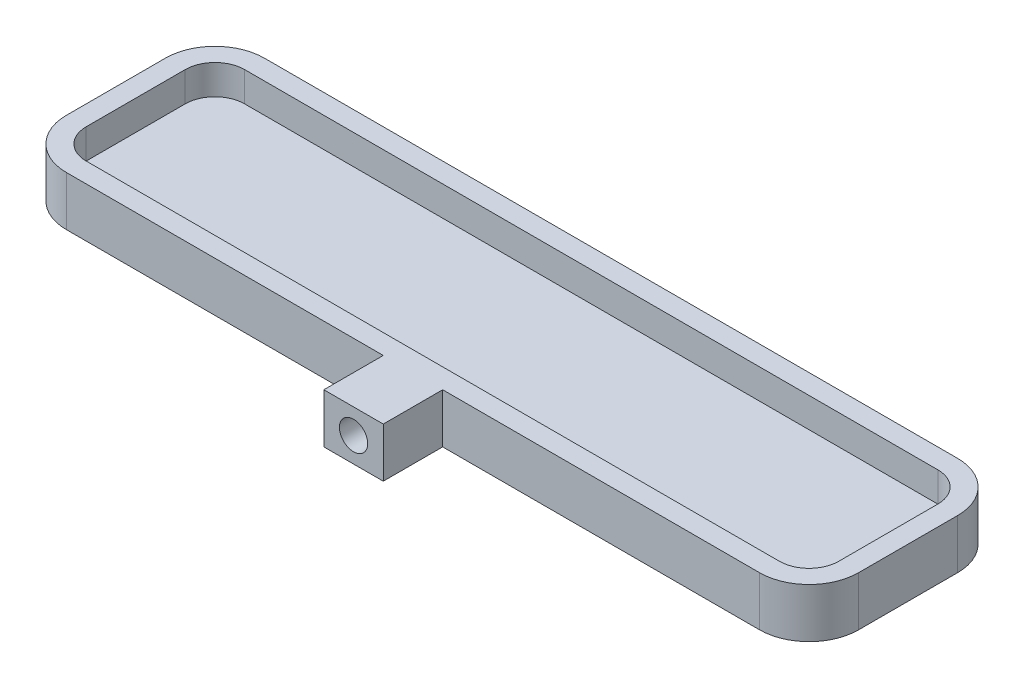
ISO-10303-21;
HEADER;
FILE_DESCRIPTION(('STEP AP214'),'2;1');
FILE_NAME('part.step','',(''),(''),'','','');
FILE_SCHEMA(('AUTOMOTIVE_DESIGN { 1 0 10303 214 1 1 1 1 }'));
ENDSEC;
DATA;
#1=APPLICATION_CONTEXT('core data for automotive mechanical design processes');
#2=APPLICATION_PROTOCOL_DEFINITION('international standard','automotive_design',2000,#1);
#3=PRODUCT_CONTEXT('',#1,'mechanical');
#4=PRODUCT('Part','Part','',(#3));
#5=PRODUCT_RELATED_PRODUCT_CATEGORY('part','',(#4));
#6=PRODUCT_DEFINITION_FORMATION('','',#4);
#7=PRODUCT_DEFINITION_CONTEXT('part definition',#1,'design');
#8=PRODUCT_DEFINITION('design','',#6,#7);
#9=PRODUCT_DEFINITION_SHAPE('','',#8);
#10=(LENGTH_UNIT() NAMED_UNIT(*) SI_UNIT(.MILLI.,.METRE.));
#11=(NAMED_UNIT(*) PLANE_ANGLE_UNIT() SI_UNIT($,.RADIAN.));
#12=(NAMED_UNIT(*) SI_UNIT($,.STERADIAN.) SOLID_ANGLE_UNIT());
#13=UNCERTAINTY_MEASURE_WITH_UNIT(LENGTH_MEASURE(1.E-05),#10,'distance_accuracy_value','');
#14=(GEOMETRIC_REPRESENTATION_CONTEXT(3) GLOBAL_UNCERTAINTY_ASSIGNED_CONTEXT((#13)) GLOBAL_UNIT_ASSIGNED_CONTEXT((#10,
#11,#12)) REPRESENTATION_CONTEXT('',''));
#15=CARTESIAN_POINT('',(0.,0.,0.));
#16=DIRECTION('',(0.,0.,1.));
#17=DIRECTION('',(1.,0.,0.));
#18=AXIS2_PLACEMENT_3D('',#15,#16,#17);
#19=CARTESIAN_POINT('',(-40.,5.,10.));
#20=DIRECTION('',(0.,0.,-1.));
#21=DIRECTION('',(-1.,0.,0.));
#22=AXIS2_PLACEMENT_3D('',#19,#20,#21);
#23=PLANE('',#22);
#24=DIRECTION('',(0.,-1.,0.));
#25=VECTOR('',#24,1.);
#26=CARTESIAN_POINT('',(-3.,0.,10.));
#27=LINE('',#26,#25);
#28=CARTESIAN_POINT('',(-3.,5.,10.));
#29=VERTEX_POINT('',#28);
#30=CARTESIAN_POINT('',(-3.,0.,10.));
#31=VERTEX_POINT('',#30);
#32=EDGE_CURVE('E63',#29,#31,#27,.T.);
#33=ORIENTED_EDGE('',*,*,#32,.F.);
#34=DIRECTION('',(1.,0.,0.));
#35=VECTOR('',#34,1.);
#36=CARTESIAN_POINT('',(-40.,5.,10.));
#37=LINE('',#36,#35);
#38=CARTESIAN_POINT('',(-35.,5.,10.));
#39=VERTEX_POINT('',#38);
#40=EDGE_CURVE('E310',#39,#29,#37,.T.);
#41=ORIENTED_EDGE('',*,*,#40,.F.);
#42=DIRECTION('',(0.,-1.,0.));
#43=VECTOR('',#42,1.);
#44=CARTESIAN_POINT('',(-35.,5.,10.));
#45=LINE('',#44,#43);
#46=CARTESIAN_POINT('',(-35.,0.,10.));
#47=VERTEX_POINT('',#46);
#48=EDGE_CURVE('E366',#39,#47,#45,.T.);
#49=ORIENTED_EDGE('',*,*,#48,.T.);
#50=DIRECTION('',(1.,0.,0.));
#51=VECTOR('',#50,1.);
#52=CARTESIAN_POINT('',(-40.,0.,10.));
#53=LINE('',#52,#51);
#54=EDGE_CURVE('E302',#47,#31,#53,.T.);
#55=ORIENTED_EDGE('',*,*,#54,.T.);
#56=EDGE_LOOP('',(#33,#41,#49,#55));
#57=FACE_BOUND('',#56,.T.);
#58=ADVANCED_FACE('F39',(#57),#23,.F.);
#59=DIRECTION('',(0.,1.,0.));
#60=VECTOR('',#59,1.);
#61=CARTESIAN_POINT('',(3.,0.,10.));
#62=LINE('',#61,#60);
#63=CARTESIAN_POINT('',(3.,0.,10.));
#64=VERTEX_POINT('',#63);
#65=CARTESIAN_POINT('',(3.,5.,10.));
#66=VERTEX_POINT('',#65);
#67=EDGE_CURVE('E202',#64,#66,#62,.T.);
#68=ORIENTED_EDGE('',*,*,#67,.F.);
#69=CARTESIAN_POINT('',(35.,0.,10.));
#70=VERTEX_POINT('',#69);
#71=EDGE_CURVE('E325',#64,#70,#53,.T.);
#72=ORIENTED_EDGE('',*,*,#71,.T.);
#73=DIRECTION('',(0.,-1.,0.));
#74=VECTOR('',#73,1.);
#75=CARTESIAN_POINT('',(35.,5.,10.));
#76=LINE('',#75,#74);
#77=CARTESIAN_POINT('',(35.,5.,10.));
#78=VERTEX_POINT('',#77);
#79=EDGE_CURVE('E370',#70,#78,#76,.F.);
#80=ORIENTED_EDGE('',*,*,#79,.T.);
#81=EDGE_CURVE('E55',#66,#78,#37,.T.);
#82=ORIENTED_EDGE('',*,*,#81,.F.);
#83=EDGE_LOOP('',(#68,#72,#80,#82));
#84=FACE_BOUND('',#83,.T.);
#85=ADVANCED_FACE('F403',(#84),#23,.F.);
#86=CARTESIAN_POINT('',(40.,5.,10.));
#87=DIRECTION('',(-1.,0.,0.));
#88=DIRECTION('',(0.,0.,1.));
#89=AXIS2_PLACEMENT_3D('',#86,#87,#88);
#90=PLANE('',#89);
#91=DIRECTION('',(0.,0.,-1.));
#92=VECTOR('',#91,1.);
#93=CARTESIAN_POINT('',(40.,0.,10.));
#94=LINE('',#93,#92);
#95=CARTESIAN_POINT('',(40.,0.,5.));
#96=VERTEX_POINT('',#95);
#97=CARTESIAN_POINT('',(40.,0.,-5.));
#98=VERTEX_POINT('',#97);
#99=EDGE_CURVE('E261',#96,#98,#94,.T.);
#100=ORIENTED_EDGE('',*,*,#99,.T.);
#101=DIRECTION('',(0.,-1.,0.));
#102=VECTOR('',#101,1.);
#103=CARTESIAN_POINT('',(40.,5.,-5.));
#104=LINE('',#103,#102);
#105=CARTESIAN_POINT('',(40.,5.,-5.));
#106=VERTEX_POINT('',#105);
#107=EDGE_CURVE('E351',#98,#106,#104,.F.);
#108=ORIENTED_EDGE('',*,*,#107,.T.);
#109=DIRECTION('',(0.,0.,-1.));
#110=VECTOR('',#109,1.);
#111=CARTESIAN_POINT('',(40.,5.,10.));
#112=LINE('',#111,#110);
#113=CARTESIAN_POINT('',(40.,5.,5.));
#114=VERTEX_POINT('',#113);
#115=EDGE_CURVE('E297',#114,#106,#112,.T.);
#116=ORIENTED_EDGE('',*,*,#115,.F.);
#117=DIRECTION('',(0.,-1.,0.));
#118=VECTOR('',#117,1.);
#119=CARTESIAN_POINT('',(40.,5.,5.));
#120=LINE('',#119,#118);
#121=EDGE_CURVE('E347',#114,#96,#120,.T.);
#122=ORIENTED_EDGE('',*,*,#121,.T.);
#123=EDGE_LOOP('',(#100,#108,#116,#122));
#124=FACE_BOUND('',#123,.T.);
#125=ADVANCED_FACE('F409',(#124),#90,.F.);
#126=CARTESIAN_POINT('',(-40.,5.,-10.));
#127=DIRECTION('',(0.,0.,1.));
#128=DIRECTION('',(1.,0.,0.));
#129=AXIS2_PLACEMENT_3D('',#126,#127,#128);
#130=PLANE('',#129);
#131=DIRECTION('',(-1.,0.,0.));
#132=VECTOR('',#131,1.);
#133=CARTESIAN_POINT('',(-40.,5.,-10.));
#134=LINE('',#133,#132);
#135=CARTESIAN_POINT('',(35.,5.,-10.));
#136=VERTEX_POINT('',#135);
#137=CARTESIAN_POINT('',(-35.,5.,-10.));
#138=VERTEX_POINT('',#137);
#139=EDGE_CURVE('E301',#136,#138,#134,.T.);
#140=ORIENTED_EDGE('',*,*,#139,.F.);
#141=DIRECTION('',(0.,-1.,0.));
#142=VECTOR('',#141,1.);
#143=CARTESIAN_POINT('',(35.,5.,-10.));
#144=LINE('',#143,#142);
#145=CARTESIAN_POINT('',(35.,0.,-10.));
#146=VERTEX_POINT('',#145);
#147=EDGE_CURVE('E330',#136,#146,#144,.T.);
#148=ORIENTED_EDGE('',*,*,#147,.T.);
#149=DIRECTION('',(-1.,0.,0.));
#150=VECTOR('',#149,1.);
#151=CARTESIAN_POINT('',(-40.,0.,-10.));
#152=LINE('',#151,#150);
#153=CARTESIAN_POINT('',(-35.,0.,-10.));
#154=VERTEX_POINT('',#153);
#155=EDGE_CURVE('E317',#146,#154,#152,.T.);
#156=ORIENTED_EDGE('',*,*,#155,.T.);
#157=DIRECTION('',(0.,-1.,0.));
#158=VECTOR('',#157,1.);
#159=CARTESIAN_POINT('',(-35.,5.,-10.));
#160=LINE('',#159,#158);
#161=EDGE_CURVE('E313',#154,#138,#160,.F.);
#162=ORIENTED_EDGE('',*,*,#161,.T.);
#163=EDGE_LOOP('',(#140,#148,#156,#162));
#164=FACE_BOUND('',#163,.T.);
#165=ADVANCED_FACE('F389',(#164),#130,.F.);
#166=CARTESIAN_POINT('',(-40.,5.,10.));
#167=DIRECTION('',(1.,0.,0.));
#168=DIRECTION('',(0.,0.,-1.));
#169=AXIS2_PLACEMENT_3D('',#166,#167,#168);
#170=PLANE('',#169);
#171=DIRECTION('',(0.,0.,1.));
#172=VECTOR('',#171,1.);
#173=CARTESIAN_POINT('',(-40.,5.,10.));
#174=LINE('',#173,#172);
#175=CARTESIAN_POINT('',(-40.,5.,-5.));
#176=VERTEX_POINT('',#175);
#177=CARTESIAN_POINT('',(-40.,5.,5.));
#178=VERTEX_POINT('',#177);
#179=EDGE_CURVE('E306',#176,#178,#174,.T.);
#180=ORIENTED_EDGE('',*,*,#179,.F.);
#181=DIRECTION('',(0.,-1.,0.));
#182=VECTOR('',#181,1.);
#183=CARTESIAN_POINT('',(-40.,5.,-5.));
#184=LINE('',#183,#182);
#185=CARTESIAN_POINT('',(-40.,0.,-5.));
#186=VERTEX_POINT('',#185);
#187=EDGE_CURVE('E11',#176,#186,#184,.T.);
#188=ORIENTED_EDGE('',*,*,#187,.T.);
#189=DIRECTION('',(0.,0.,1.));
#190=VECTOR('',#189,1.);
#191=CARTESIAN_POINT('',(-40.,0.,10.));
#192=LINE('',#191,#190);
#193=CARTESIAN_POINT('',(-40.,0.,5.));
#194=VERTEX_POINT('',#193);
#195=EDGE_CURVE('E321',#186,#194,#192,.T.);
#196=ORIENTED_EDGE('',*,*,#195,.T.);
#197=DIRECTION('',(0.,-1.,0.));
#198=VECTOR('',#197,1.);
#199=CARTESIAN_POINT('',(-40.,5.,5.));
#200=LINE('',#199,#198);
#201=EDGE_CURVE('E48',#194,#178,#200,.F.);
#202=ORIENTED_EDGE('',*,*,#201,.T.);
#203=EDGE_LOOP('',(#180,#188,#196,#202));
#204=FACE_BOUND('',#203,.T.);
#205=ADVANCED_FACE('F376',(#204),#170,.F.);
#206=CARTESIAN_POINT('',(0.,5.,0.));
#207=DIRECTION('',(0.,-1.,0.));
#208=DIRECTION('',(0.,0.,-1.));
#209=AXIS2_PLACEMENT_3D('',#206,#207,#208);
#210=PLANE('',#209);
#211=DIRECTION('',(0.,0.,-1.));
#212=VECTOR('',#211,1.);
#213=CARTESIAN_POINT('',(38.,5.,0.));
#214=LINE('',#213,#212);
#215=CARTESIAN_POINT('',(38.,5.,5.));
#216=VERTEX_POINT('',#215);
#217=CARTESIAN_POINT('',(38.,5.,-5.));
#218=VERTEX_POINT('',#217);
#219=EDGE_CURVE('E240',#216,#218,#214,.T.);
#220=ORIENTED_EDGE('',*,*,#219,.F.);
#221=CARTESIAN_POINT('',(35.,5.,5.));
#222=DIRECTION('',(0.,-1.,0.));
#223=DIRECTION('',(0.,0.,-1.));
#224=AXIS2_PLACEMENT_3D('',#221,#222,#223);
#225=CIRCLE('',#224,3.);
#226=CARTESIAN_POINT('',(35.,5.,8.));
#227=VERTEX_POINT('',#226);
#228=EDGE_CURVE('E280',#227,#216,#225,.F.);
#229=ORIENTED_EDGE('',*,*,#228,.F.);
#230=DIRECTION('',(1.,0.,0.));
#231=VECTOR('',#230,1.);
#232=CARTESIAN_POINT('',(0.,5.,8.));
#233=LINE('',#232,#231);
#234=CARTESIAN_POINT('',(-35.,5.,8.));
#235=VERTEX_POINT('',#234);
#236=EDGE_CURVE('E256',#235,#227,#233,.T.);
#237=ORIENTED_EDGE('',*,*,#236,.F.);
#238=CARTESIAN_POINT('',(-35.,5.,5.));
#239=DIRECTION('',(0.,-1.,0.));
#240=DIRECTION('',(0.,0.,-1.));
#241=AXIS2_PLACEMENT_3D('',#238,#239,#240);
#242=CIRCLE('',#241,3.);
#243=CARTESIAN_POINT('',(-38.,5.,5.));
#244=VERTEX_POINT('',#243);
#245=EDGE_CURVE('E220',#244,#235,#242,.F.);
#246=ORIENTED_EDGE('',*,*,#245,.F.);
#247=DIRECTION('',(0.,0.,1.));
#248=VECTOR('',#247,1.);
#249=CARTESIAN_POINT('',(-38.,5.,0.));
#250=LINE('',#249,#248);
#251=CARTESIAN_POINT('',(-38.,5.,-5.));
#252=VERTEX_POINT('',#251);
#253=EDGE_CURVE('E284',#252,#244,#250,.T.);
#254=ORIENTED_EDGE('',*,*,#253,.F.);
#255=CARTESIAN_POINT('',(-35.,5.,-5.));
#256=DIRECTION('',(0.,-1.,0.));
#257=DIRECTION('',(0.,0.,-1.));
#258=AXIS2_PLACEMENT_3D('',#255,#256,#257);
#259=CIRCLE('',#258,3.);
#260=CARTESIAN_POINT('',(-35.,5.,-8.));
#261=VERTEX_POINT('',#260);
#262=EDGE_CURVE('E285',#261,#252,#259,.F.);
#263=ORIENTED_EDGE('',*,*,#262,.F.);
#264=DIRECTION('',(-1.,0.,0.));
#265=VECTOR('',#264,1.);
#266=CARTESIAN_POINT('',(0.,5.,-8.));
#267=LINE('',#266,#265);
#268=CARTESIAN_POINT('',(35.,5.,-8.));
#269=VERTEX_POINT('',#268);
#270=EDGE_CURVE('E277',#269,#261,#267,.T.);
#271=ORIENTED_EDGE('',*,*,#270,.F.);
#272=CARTESIAN_POINT('',(35.,5.,-5.));
#273=DIRECTION('',(0.,-1.,0.));
#274=DIRECTION('',(0.,0.,-1.));
#275=AXIS2_PLACEMENT_3D('',#272,#273,#274);
#276=CIRCLE('',#275,3.);
#277=EDGE_CURVE('E270',#218,#269,#276,.F.);
#278=ORIENTED_EDGE('',*,*,#277,.F.);
#279=EDGE_LOOP('',(#220,#229,#237,#246,#254,#263,#271,#278));
#280=FACE_BOUND('',#279,.T.);
#281=ORIENTED_EDGE('',*,*,#115,.T.);
#282=CARTESIAN_POINT('',(35.,5.,-5.));
#283=DIRECTION('',(0.,-1.,0.));
#284=DIRECTION('',(0.,0.,-1.));
#285=AXIS2_PLACEMENT_3D('',#282,#283,#284);
#286=CIRCLE('',#285,5.);
#287=EDGE_CURVE('E363',#106,#136,#286,.F.);
#288=ORIENTED_EDGE('',*,*,#287,.T.);
#289=ORIENTED_EDGE('',*,*,#139,.T.);
#290=CARTESIAN_POINT('',(-35.,5.,-5.));
#291=DIRECTION('',(0.,-1.,0.));
#292=DIRECTION('',(0.,0.,-1.));
#293=AXIS2_PLACEMENT_3D('',#290,#291,#292);
#294=CIRCLE('',#293,5.);
#295=EDGE_CURVE('E357',#138,#176,#294,.F.);
#296=ORIENTED_EDGE('',*,*,#295,.T.);
#297=ORIENTED_EDGE('',*,*,#179,.T.);
#298=CARTESIAN_POINT('',(-35.,5.,5.));
#299=DIRECTION('',(0.,-1.,0.));
#300=DIRECTION('',(0.,0.,-1.));
#301=AXIS2_PLACEMENT_3D('',#298,#299,#300);
#302=CIRCLE('',#301,5.);
#303=EDGE_CURVE('E354',#178,#39,#302,.F.);
#304=ORIENTED_EDGE('',*,*,#303,.T.);
#305=ORIENTED_EDGE('',*,*,#40,.T.);
#306=DIRECTION('',(0.,0.,-1.));
#307=VECTOR('',#306,1.);
#308=CARTESIAN_POINT('',(-3.,5.,16.));
#309=LINE('',#308,#307);
#310=CARTESIAN_POINT('',(-3.,5.,16.));
#311=VERTEX_POINT('',#310);
#312=EDGE_CURVE('E442',#311,#29,#309,.T.);
#313=ORIENTED_EDGE('',*,*,#312,.F.);
#314=DIRECTION('',(-1.,0.,0.));
#315=VECTOR('',#314,1.);
#316=CARTESIAN_POINT('',(-3.,5.,16.));
#317=LINE('',#316,#315);
#318=CARTESIAN_POINT('',(3.,5.,16.));
#319=VERTEX_POINT('',#318);
#320=EDGE_CURVE('E197',#319,#311,#317,.T.);
#321=ORIENTED_EDGE('',*,*,#320,.F.);
#322=DIRECTION('',(0.,0.,-1.));
#323=VECTOR('',#322,1.);
#324=CARTESIAN_POINT('',(3.,5.,16.));
#325=LINE('',#324,#323);
#326=EDGE_CURVE('E213',#319,#66,#325,.T.);
#327=ORIENTED_EDGE('',*,*,#326,.T.);
#328=ORIENTED_EDGE('',*,*,#81,.T.);
#329=CARTESIAN_POINT('',(35.,5.,5.));
#330=DIRECTION('',(0.,-1.,0.));
#331=DIRECTION('',(0.,0.,-1.));
#332=AXIS2_PLACEMENT_3D('',#329,#330,#331);
#333=CIRCLE('',#332,5.);
#334=EDGE_CURVE('E360',#78,#114,#333,.F.);
#335=ORIENTED_EDGE('',*,*,#334,.T.);
#336=EDGE_LOOP('',(#281,#288,#289,#296,#297,#304,#305,#313,#321,#327,#328,#335));
#337=FACE_BOUND('',#336,.T.);
#338=ADVANCED_FACE('F382',(#280,#337),#210,.F.);
#339=CARTESIAN_POINT('',(0.,0.,0.));
#340=DIRECTION('',(0.,-1.,0.));
#341=DIRECTION('',(0.,0.,-1.));
#342=AXIS2_PLACEMENT_3D('',#339,#340,#341);
#343=PLANE('',#342);
#344=ORIENTED_EDGE('',*,*,#155,.F.);
#345=CARTESIAN_POINT('',(35.,0.,-5.));
#346=DIRECTION('',(0.,-1.,0.));
#347=DIRECTION('',(0.,0.,-1.));
#348=AXIS2_PLACEMENT_3D('',#345,#346,#347);
#349=CIRCLE('',#348,5.);
#350=EDGE_CURVE('E344',#146,#98,#349,.T.);
#351=ORIENTED_EDGE('',*,*,#350,.T.);
#352=ORIENTED_EDGE('',*,*,#99,.F.);
#353=CARTESIAN_POINT('',(35.,0.,5.));
#354=DIRECTION('',(0.,-1.,0.));
#355=DIRECTION('',(0.,0.,-1.));
#356=AXIS2_PLACEMENT_3D('',#353,#354,#355);
#357=CIRCLE('',#356,5.);
#358=EDGE_CURVE('E340',#96,#70,#357,.T.);
#359=ORIENTED_EDGE('',*,*,#358,.T.);
#360=ORIENTED_EDGE('',*,*,#71,.F.);
#361=DIRECTION('',(0.,0.,-1.));
#362=VECTOR('',#361,1.);
#363=CARTESIAN_POINT('',(3.,0.,16.));
#364=LINE('',#363,#362);
#365=CARTESIAN_POINT('',(3.,0.,16.));
#366=VERTEX_POINT('',#365);
#367=EDGE_CURVE('E187',#366,#64,#364,.T.);
#368=ORIENTED_EDGE('',*,*,#367,.F.);
#369=DIRECTION('',(1.,0.,0.));
#370=VECTOR('',#369,1.);
#371=CARTESIAN_POINT('',(-3.,0.,16.));
#372=LINE('',#371,#370);
#373=CARTESIAN_POINT('',(-3.,0.,16.));
#374=VERTEX_POINT('',#373);
#375=EDGE_CURVE('E179',#374,#366,#372,.T.);
#376=ORIENTED_EDGE('',*,*,#375,.F.);
#377=DIRECTION('',(0.,0.,-1.));
#378=VECTOR('',#377,1.);
#379=CARTESIAN_POINT('',(-3.,0.,16.));
#380=LINE('',#379,#378);
#381=EDGE_CURVE('E185',#374,#31,#380,.T.);
#382=ORIENTED_EDGE('',*,*,#381,.T.);
#383=ORIENTED_EDGE('',*,*,#54,.F.);
#384=CARTESIAN_POINT('',(-35.,0.,5.));
#385=DIRECTION('',(0.,-1.,0.));
#386=DIRECTION('',(0.,0.,-1.));
#387=AXIS2_PLACEMENT_3D('',#384,#385,#386);
#388=CIRCLE('',#387,5.);
#389=EDGE_CURVE('E334',#47,#194,#388,.T.);
#390=ORIENTED_EDGE('',*,*,#389,.T.);
#391=ORIENTED_EDGE('',*,*,#195,.F.);
#392=CARTESIAN_POINT('',(-35.,0.,-5.));
#393=DIRECTION('',(0.,-1.,0.));
#394=DIRECTION('',(0.,0.,-1.));
#395=AXIS2_PLACEMENT_3D('',#392,#393,#394);
#396=CIRCLE('',#395,5.);
#397=EDGE_CURVE('E337',#186,#154,#396,.T.);
#398=ORIENTED_EDGE('',*,*,#397,.T.);
#399=EDGE_LOOP('',(#344,#351,#352,#359,#360,#368,#376,#382,#383,#390,#391,#398));
#400=FACE_BOUND('',#399,.T.);
#401=ADVANCED_FACE('F182',(#400),#343,.T.);
#402=CARTESIAN_POINT('',(35.,5.,-5.));
#403=DIRECTION('',(0.,-1.,0.));
#404=DIRECTION('',(0.,0.,-1.));
#405=AXIS2_PLACEMENT_3D('',#402,#403,#404);
#406=CYLINDRICAL_SURFACE('',#405,5.);
#407=ORIENTED_EDGE('',*,*,#287,.F.);
#408=ORIENTED_EDGE('',*,*,#107,.F.);
#409=ORIENTED_EDGE('',*,*,#350,.F.);
#410=ORIENTED_EDGE('',*,*,#147,.F.);
#411=EDGE_LOOP('',(#407,#408,#409,#410));
#412=FACE_BOUND('',#411,.T.);
#413=ADVANCED_FACE('F399',(#412),#406,.T.);
#414=CARTESIAN_POINT('',(35.,5.,5.));
#415=DIRECTION('',(0.,-1.,0.));
#416=DIRECTION('',(0.,0.,-1.));
#417=AXIS2_PLACEMENT_3D('',#414,#415,#416);
#418=CYLINDRICAL_SURFACE('',#417,5.);
#419=ORIENTED_EDGE('',*,*,#334,.F.);
#420=ORIENTED_EDGE('',*,*,#79,.F.);
#421=ORIENTED_EDGE('',*,*,#358,.F.);
#422=ORIENTED_EDGE('',*,*,#121,.F.);
#423=EDGE_LOOP('',(#419,#420,#421,#422));
#424=FACE_BOUND('',#423,.T.);
#425=ADVANCED_FACE('F393',(#424),#418,.T.);
#426=CARTESIAN_POINT('',(-35.,5.,-5.));
#427=DIRECTION('',(0.,-1.,0.));
#428=DIRECTION('',(0.,0.,-1.));
#429=AXIS2_PLACEMENT_3D('',#426,#427,#428);
#430=CYLINDRICAL_SURFACE('',#429,5.);
#431=ORIENTED_EDGE('',*,*,#295,.F.);
#432=ORIENTED_EDGE('',*,*,#161,.F.);
#433=ORIENTED_EDGE('',*,*,#397,.F.);
#434=ORIENTED_EDGE('',*,*,#187,.F.);
#435=EDGE_LOOP('',(#431,#432,#433,#434));
#436=FACE_BOUND('',#435,.T.);
#437=ADVANCED_FACE('F391',(#436),#430,.T.);
#438=CARTESIAN_POINT('',(-35.,5.,5.));
#439=DIRECTION('',(0.,-1.,0.));
#440=DIRECTION('',(0.,0.,-1.));
#441=AXIS2_PLACEMENT_3D('',#438,#439,#440);
#442=CYLINDRICAL_SURFACE('',#441,5.);
#443=ORIENTED_EDGE('',*,*,#303,.F.);
#444=ORIENTED_EDGE('',*,*,#201,.F.);
#445=ORIENTED_EDGE('',*,*,#389,.F.);
#446=ORIENTED_EDGE('',*,*,#48,.F.);
#447=EDGE_LOOP('',(#443,#444,#445,#446));
#448=FACE_BOUND('',#447,.T.);
#449=ADVANCED_FACE('F41',(#448),#442,.T.);
#450=CARTESIAN_POINT('',(38.,5.,10.));
#451=DIRECTION('',(-1.,0.,0.));
#452=DIRECTION('',(0.,0.,1.));
#453=AXIS2_PLACEMENT_3D('',#450,#451,#452);
#454=PLANE('',#453);
#455=DIRECTION('',(0.,0.,-1.));
#456=VECTOR('',#455,1.);
#457=CARTESIAN_POINT('',(38.,2.,0.));
#458=LINE('',#457,#456);
#459=CARTESIAN_POINT('',(38.,2.,5.));
#460=VERTEX_POINT('',#459);
#461=CARTESIAN_POINT('',(38.,2.,-5.));
#462=VERTEX_POINT('',#461);
#463=EDGE_CURVE('E206',#460,#462,#458,.T.);
#464=ORIENTED_EDGE('',*,*,#463,.F.);
#465=DIRECTION('',(0.,1.,0.));
#466=VECTOR('',#465,1.);
#467=CARTESIAN_POINT('',(38.,5.,5.));
#468=LINE('',#467,#466);
#469=EDGE_CURVE('E221',#216,#460,#468,.F.);
#470=ORIENTED_EDGE('',*,*,#469,.F.);
#471=ORIENTED_EDGE('',*,*,#219,.T.);
#472=DIRECTION('',(0.,1.,0.));
#473=VECTOR('',#472,1.);
#474=CARTESIAN_POINT('',(38.,5.,-5.));
#475=LINE('',#474,#473);
#476=EDGE_CURVE('E217',#462,#218,#475,.T.);
#477=ORIENTED_EDGE('',*,*,#476,.F.);
#478=EDGE_LOOP('',(#464,#470,#471,#477));
#479=FACE_BOUND('',#478,.T.);
#480=ADVANCED_FACE('F398',(#479),#454,.T.);
#481=CARTESIAN_POINT('',(-40.,5.,-8.));
#482=DIRECTION('',(0.,0.,1.));
#483=DIRECTION('',(1.,0.,0.));
#484=AXIS2_PLACEMENT_3D('',#481,#482,#483);
#485=PLANE('',#484);
#486=ORIENTED_EDGE('',*,*,#270,.T.);
#487=DIRECTION('',(0.,1.,0.));
#488=VECTOR('',#487,1.);
#489=CARTESIAN_POINT('',(-35.,5.,-8.));
#490=LINE('',#489,#488);
#491=CARTESIAN_POINT('',(-35.,2.,-8.));
#492=VERTEX_POINT('',#491);
#493=EDGE_CURVE('E253',#492,#261,#490,.T.);
#494=ORIENTED_EDGE('',*,*,#493,.F.);
#495=DIRECTION('',(-1.,0.,0.));
#496=VECTOR('',#495,1.);
#497=CARTESIAN_POINT('',(0.,2.,-8.));
#498=LINE('',#497,#496);
#499=CARTESIAN_POINT('',(35.,2.,-8.));
#500=VERTEX_POINT('',#499);
#501=EDGE_CURVE('E211',#500,#492,#498,.T.);
#502=ORIENTED_EDGE('',*,*,#501,.F.);
#503=DIRECTION('',(0.,1.,0.));
#504=VECTOR('',#503,1.);
#505=CARTESIAN_POINT('',(35.,5.,-8.));
#506=LINE('',#505,#504);
#507=EDGE_CURVE('E244',#269,#500,#506,.F.);
#508=ORIENTED_EDGE('',*,*,#507,.F.);
#509=EDGE_LOOP('',(#486,#494,#502,#508));
#510=FACE_BOUND('',#509,.T.);
#511=ADVANCED_FACE('F481',(#510),#485,.T.);
#512=CARTESIAN_POINT('',(-38.,5.,10.));
#513=DIRECTION('',(1.,0.,0.));
#514=DIRECTION('',(0.,0.,-1.));
#515=AXIS2_PLACEMENT_3D('',#512,#513,#514);
#516=PLANE('',#515);
#517=ORIENTED_EDGE('',*,*,#253,.T.);
#518=DIRECTION('',(0.,1.,0.));
#519=VECTOR('',#518,1.);
#520=CARTESIAN_POINT('',(-38.,5.,5.));
#521=LINE('',#520,#519);
#522=CARTESIAN_POINT('',(-38.,2.,5.));
#523=VERTEX_POINT('',#522);
#524=EDGE_CURVE('E262',#523,#244,#521,.T.);
#525=ORIENTED_EDGE('',*,*,#524,.F.);
#526=DIRECTION('',(0.,0.,1.));
#527=VECTOR('',#526,1.);
#528=CARTESIAN_POINT('',(-38.,2.,0.));
#529=LINE('',#528,#527);
#530=CARTESIAN_POINT('',(-38.,2.,-5.));
#531=VERTEX_POINT('',#530);
#532=EDGE_CURVE('E229',#531,#523,#529,.T.);
#533=ORIENTED_EDGE('',*,*,#532,.F.);
#534=DIRECTION('',(0.,1.,0.));
#535=VECTOR('',#534,1.);
#536=CARTESIAN_POINT('',(-38.,5.,-5.));
#537=LINE('',#536,#535);
#538=EDGE_CURVE('E257',#252,#531,#537,.F.);
#539=ORIENTED_EDGE('',*,*,#538,.F.);
#540=EDGE_LOOP('',(#517,#525,#533,#539));
#541=FACE_BOUND('',#540,.T.);
#542=ADVANCED_FACE('F485',(#541),#516,.T.);
#543=CARTESIAN_POINT('',(-40.,5.,8.));
#544=DIRECTION('',(0.,0.,-1.));
#545=DIRECTION('',(-1.,0.,0.));
#546=AXIS2_PLACEMENT_3D('',#543,#544,#545);
#547=PLANE('',#546);
#548=DIRECTION('',(1.,0.,0.));
#549=VECTOR('',#548,1.);
#550=CARTESIAN_POINT('',(0.,2.,8.));
#551=LINE('',#550,#549);
#552=CARTESIAN_POINT('',(-35.,2.,8.));
#553=VERTEX_POINT('',#552);
#554=CARTESIAN_POINT('',(35.,2.,8.));
#555=VERTEX_POINT('',#554);
#556=EDGE_CURVE('E236',#553,#555,#551,.T.);
#557=ORIENTED_EDGE('',*,*,#556,.F.);
#558=DIRECTION('',(0.,1.,0.));
#559=VECTOR('',#558,1.);
#560=CARTESIAN_POINT('',(-35.,5.,8.));
#561=LINE('',#560,#559);
#562=EDGE_CURVE('E266',#235,#553,#561,.F.);
#563=ORIENTED_EDGE('',*,*,#562,.F.);
#564=ORIENTED_EDGE('',*,*,#236,.T.);
#565=DIRECTION('',(0.,1.,0.));
#566=VECTOR('',#565,1.);
#567=CARTESIAN_POINT('',(35.,5.,8.));
#568=LINE('',#567,#566);
#569=EDGE_CURVE('E265',#555,#227,#568,.T.);
#570=ORIENTED_EDGE('',*,*,#569,.F.);
#571=EDGE_LOOP('',(#557,#563,#564,#570));
#572=FACE_BOUND('',#571,.T.);
#573=ADVANCED_FACE('F489',(#572),#547,.T.);
#574=CARTESIAN_POINT('',(0.,2.,0.));
#575=DIRECTION('',(0.,-1.,0.));
#576=DIRECTION('',(0.,0.,-1.));
#577=AXIS2_PLACEMENT_3D('',#574,#575,#576);
#578=PLANE('',#577);
#579=ORIENTED_EDGE('',*,*,#501,.T.);
#580=CARTESIAN_POINT('',(-35.,2.,-5.));
#581=DIRECTION('',(0.,-1.,0.));
#582=DIRECTION('',(0.,0.,-1.));
#583=AXIS2_PLACEMENT_3D('',#580,#581,#582);
#584=CIRCLE('',#583,3.);
#585=EDGE_CURVE('E235',#531,#492,#584,.T.);
#586=ORIENTED_EDGE('',*,*,#585,.F.);
#587=ORIENTED_EDGE('',*,*,#532,.T.);
#588=CARTESIAN_POINT('',(-35.,2.,5.));
#589=DIRECTION('',(0.,-1.,0.));
#590=DIRECTION('',(0.,0.,-1.));
#591=AXIS2_PLACEMENT_3D('',#588,#589,#590);
#592=CIRCLE('',#591,3.);
#593=EDGE_CURVE('E241',#553,#523,#592,.T.);
#594=ORIENTED_EDGE('',*,*,#593,.F.);
#595=ORIENTED_EDGE('',*,*,#556,.T.);
#596=CARTESIAN_POINT('',(35.,2.,5.));
#597=DIRECTION('',(0.,-1.,0.));
#598=DIRECTION('',(0.,0.,-1.));
#599=AXIS2_PLACEMENT_3D('',#596,#597,#598);
#600=CIRCLE('',#599,3.);
#601=EDGE_CURVE('E232',#460,#555,#600,.T.);
#602=ORIENTED_EDGE('',*,*,#601,.F.);
#603=ORIENTED_EDGE('',*,*,#463,.T.);
#604=CARTESIAN_POINT('',(35.,2.,-5.));
#605=DIRECTION('',(0.,-1.,0.));
#606=DIRECTION('',(0.,0.,-1.));
#607=AXIS2_PLACEMENT_3D('',#604,#605,#606);
#608=CIRCLE('',#607,3.);
#609=EDGE_CURVE('E225',#500,#462,#608,.T.);
#610=ORIENTED_EDGE('',*,*,#609,.F.);
#611=EDGE_LOOP('',(#579,#586,#587,#594,#595,#602,#603,#610));
#612=FACE_BOUND('',#611,.T.);
#613=ADVANCED_FACE('F493',(#612),#578,.F.);
#614=CARTESIAN_POINT('',(35.,5.,-5.));
#615=DIRECTION('',(0.,-1.,0.));
#616=DIRECTION('',(0.,0.,-1.));
#617=AXIS2_PLACEMENT_3D('',#614,#615,#616);
#618=CYLINDRICAL_SURFACE('',#617,3.);
#619=ORIENTED_EDGE('',*,*,#277,.T.);
#620=ORIENTED_EDGE('',*,*,#507,.T.);
#621=ORIENTED_EDGE('',*,*,#609,.T.);
#622=ORIENTED_EDGE('',*,*,#476,.T.);
#623=EDGE_LOOP('',(#619,#620,#621,#622));
#624=FACE_BOUND('',#623,.T.);
#625=ADVANCED_FACE('F497',(#624),#618,.F.);
#626=CARTESIAN_POINT('',(35.,5.,5.));
#627=DIRECTION('',(0.,-1.,0.));
#628=DIRECTION('',(0.,0.,-1.));
#629=AXIS2_PLACEMENT_3D('',#626,#627,#628);
#630=CYLINDRICAL_SURFACE('',#629,3.);
#631=ORIENTED_EDGE('',*,*,#228,.T.);
#632=ORIENTED_EDGE('',*,*,#469,.T.);
#633=ORIENTED_EDGE('',*,*,#601,.T.);
#634=ORIENTED_EDGE('',*,*,#569,.T.);
#635=EDGE_LOOP('',(#631,#632,#633,#634));
#636=FACE_BOUND('',#635,.T.);
#637=ADVANCED_FACE('F501',(#636),#630,.F.);
#638=CARTESIAN_POINT('',(-35.,5.,-5.));
#639=DIRECTION('',(0.,-1.,0.));
#640=DIRECTION('',(0.,0.,-1.));
#641=AXIS2_PLACEMENT_3D('',#638,#639,#640);
#642=CYLINDRICAL_SURFACE('',#641,3.);
#643=ORIENTED_EDGE('',*,*,#262,.T.);
#644=ORIENTED_EDGE('',*,*,#538,.T.);
#645=ORIENTED_EDGE('',*,*,#585,.T.);
#646=ORIENTED_EDGE('',*,*,#493,.T.);
#647=EDGE_LOOP('',(#643,#644,#645,#646));
#648=FACE_BOUND('',#647,.T.);
#649=ADVANCED_FACE('F505',(#648),#642,.F.);
#650=CARTESIAN_POINT('',(-35.,5.,5.));
#651=DIRECTION('',(0.,-1.,0.));
#652=DIRECTION('',(0.,0.,-1.));
#653=AXIS2_PLACEMENT_3D('',#650,#651,#652);
#654=CYLINDRICAL_SURFACE('',#653,3.);
#655=ORIENTED_EDGE('',*,*,#245,.T.);
#656=ORIENTED_EDGE('',*,*,#562,.T.);
#657=ORIENTED_EDGE('',*,*,#593,.T.);
#658=ORIENTED_EDGE('',*,*,#524,.T.);
#659=EDGE_LOOP('',(#655,#656,#657,#658));
#660=FACE_BOUND('',#659,.T.);
#661=ADVANCED_FACE('F478',(#660),#654,.F.);
#662=CARTESIAN_POINT('',(-3.,0.,16.));
#663=DIRECTION('',(1.,0.,0.));
#664=DIRECTION('',(0.,1.,0.));
#665=AXIS2_PLACEMENT_3D('',#662,#663,#664);
#666=PLANE('',#665);
#667=ORIENTED_EDGE('',*,*,#32,.T.);
#668=ORIENTED_EDGE('',*,*,#381,.F.);
#669=DIRECTION('',(0.,-1.,0.));
#670=VECTOR('',#669,1.);
#671=CARTESIAN_POINT('',(-3.,0.,16.));
#672=LINE('',#671,#670);
#673=EDGE_CURVE('E192',#311,#374,#672,.T.);
#674=ORIENTED_EDGE('',*,*,#673,.F.);
#675=ORIENTED_EDGE('',*,*,#312,.T.);
#676=EDGE_LOOP('',(#667,#668,#674,#675));
#677=FACE_BOUND('',#676,.T.);
#678=ADVANCED_FACE('F204',(#677),#666,.F.);
#679=CARTESIAN_POINT('',(3.,0.,16.));
#680=DIRECTION('',(-1.,0.,0.));
#681=DIRECTION('',(0.,-1.,0.));
#682=AXIS2_PLACEMENT_3D('',#679,#680,#681);
#683=PLANE('',#682);
#684=ORIENTED_EDGE('',*,*,#67,.T.);
#685=ORIENTED_EDGE('',*,*,#326,.F.);
#686=DIRECTION('',(0.,1.,0.));
#687=VECTOR('',#686,1.);
#688=CARTESIAN_POINT('',(3.,0.,16.));
#689=LINE('',#688,#687);
#690=EDGE_CURVE('E191',#366,#319,#689,.T.);
#691=ORIENTED_EDGE('',*,*,#690,.F.);
#692=ORIENTED_EDGE('',*,*,#367,.T.);
#693=EDGE_LOOP('',(#684,#685,#691,#692));
#694=FACE_BOUND('',#693,.T.);
#695=ADVANCED_FACE('F438',(#694),#683,.F.);
#696=CARTESIAN_POINT('',(0.,0.,16.));
#697=DIRECTION('',(0.,0.,-1.));
#698=DIRECTION('',(-1.,0.,0.));
#699=AXIS2_PLACEMENT_3D('',#696,#697,#698);
#700=PLANE('',#699);
#701=CARTESIAN_POINT('',(0.,2.5,16.));
#702=DIRECTION('',(0.,0.,1.));
#703=DIRECTION('',(1.,0.,0.));
#704=AXIS2_PLACEMENT_3D('',#701,#702,#703);
#705=CIRCLE('',#704,1.425);
#706=CARTESIAN_POINT('',(1.425,2.5,16.));
#707=VERTEX_POINT('',#706);
#708=EDGE_CURVE('E453',#707,#707,#705,.T.);
#709=ORIENTED_EDGE('',*,*,#708,.F.);
#710=EDGE_LOOP('',(#709));
#711=FACE_BOUND('',#710,.T.);
#712=ORIENTED_EDGE('',*,*,#673,.T.);
#713=ORIENTED_EDGE('',*,*,#375,.T.);
#714=ORIENTED_EDGE('',*,*,#690,.T.);
#715=ORIENTED_EDGE('',*,*,#320,.T.);
#716=EDGE_LOOP('',(#712,#713,#714,#715));
#717=FACE_BOUND('',#716,.T.);
#718=ADVANCED_FACE('F195',(#711,#717),#700,.F.);
#719=CARTESIAN_POINT('',(0.,2.5,12.));
#720=DIRECTION('',(0.,0.,1.));
#721=DIRECTION('',(1.,0.,0.));
#722=AXIS2_PLACEMENT_3D('',#719,#720,#721);
#723=CYLINDRICAL_SURFACE('',#722,1.425);
#724=CARTESIAN_POINT('',(0.,2.5,12.));
#725=DIRECTION('',(0.,0.,1.));
#726=DIRECTION('',(1.,0.,0.));
#727=AXIS2_PLACEMENT_3D('',#724,#725,#726);
#728=CIRCLE('',#727,1.425);
#729=CARTESIAN_POINT('',(1.425,2.5,12.));
#730=VERTEX_POINT('',#729);
#731=EDGE_CURVE('E446',#730,#730,#728,.T.);
#732=ORIENTED_EDGE('',*,*,#731,.F.);
#733=EDGE_LOOP('',(#732));
#734=FACE_BOUND('',#733,.T.);
#735=ORIENTED_EDGE('',*,*,#708,.T.);
#736=EDGE_LOOP('',(#735));
#737=FACE_BOUND('',#736,.T.);
#738=ADVANCED_FACE('F462',(#734,#737),#723,.F.);
#739=CARTESIAN_POINT('',(0.,2.5,12.));
#740=DIRECTION('',(0.,0.,1.));
#741=DIRECTION('',(1.,0.,0.));
#742=AXIS2_PLACEMENT_3D('',#739,#740,#741);
#743=PLANE('',#742);
#744=ORIENTED_EDGE('',*,*,#731,.T.);
#745=EDGE_LOOP('',(#744));
#746=FACE_BOUND('',#745,.T.);
#747=ADVANCED_FACE('F470',(#746),#743,.T.);
#748=CLOSED_SHELL('',(#58,#85,#125,#165,#205,#338,#401,#413,#425,#437,#449,#480,#511,#542,#573,
#613,#625,#637,#649,#661,#678,#695,#718,#738,#747));
#749=MANIFOLD_SOLID_BREP('B2',#748);
#750=ADVANCED_BREP_SHAPE_REPRESENTATION('',(#18,#749),#14);
#751=SHAPE_DEFINITION_REPRESENTATION(#9,#750);
ENDSEC;
END-ISO-10303-21;
